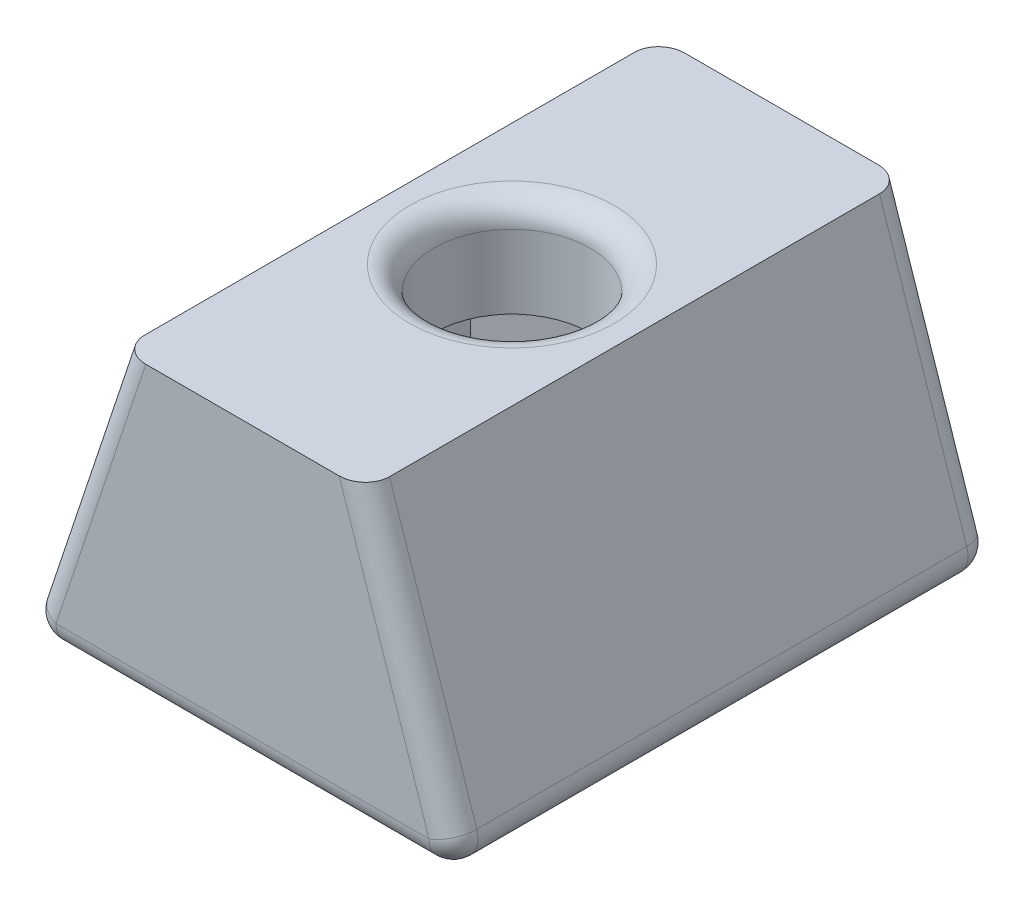
ISO-10303-21;
HEADER;
FILE_DESCRIPTION(('STEP AP214'),'2;1');
FILE_NAME('part.step','',(''),(''),'','','');
FILE_SCHEMA(('AUTOMOTIVE_DESIGN { 1 0 10303 214 1 1 1 1 }'));
ENDSEC;
DATA;
#1=APPLICATION_CONTEXT('core data for automotive mechanical design processes');
#2=APPLICATION_PROTOCOL_DEFINITION('international standard','automotive_design',2000,#1);
#3=PRODUCT_CONTEXT('',#1,'mechanical');
#4=PRODUCT('Part','Part','',(#3));
#5=PRODUCT_RELATED_PRODUCT_CATEGORY('part','',(#4));
#6=PRODUCT_DEFINITION_FORMATION('','',#4);
#7=PRODUCT_DEFINITION_CONTEXT('part definition',#1,'design');
#8=PRODUCT_DEFINITION('design','',#6,#7);
#9=PRODUCT_DEFINITION_SHAPE('','',#8);
#10=(LENGTH_UNIT() NAMED_UNIT(*) SI_UNIT(.MILLI.,.METRE.));
#11=(NAMED_UNIT(*) PLANE_ANGLE_UNIT() SI_UNIT($,.RADIAN.));
#12=(NAMED_UNIT(*) SI_UNIT($,.STERADIAN.) SOLID_ANGLE_UNIT());
#13=UNCERTAINTY_MEASURE_WITH_UNIT(LENGTH_MEASURE(1.E-05),#10,'distance_accuracy_value','');
#14=(GEOMETRIC_REPRESENTATION_CONTEXT(3) GLOBAL_UNCERTAINTY_ASSIGNED_CONTEXT((#13)) GLOBAL_UNIT_ASSIGNED_CONTEXT((#10,
#11,#12)) REPRESENTATION_CONTEXT('',''));
#15=CARTESIAN_POINT('',(0.,0.,0.));
#16=DIRECTION('',(0.,0.,1.));
#17=DIRECTION('',(1.,0.,0.));
#18=AXIS2_PLACEMENT_3D('',#15,#16,#17);
#19=CARTESIAN_POINT('',(3.99884838976547,12.,-22.));
#20=DIRECTION('',(-0.948710608132913,0.31614582397381,0.));
#21=DIRECTION('',(-0.31614582397381,-0.948710608132913,0.));
#22=AXIS2_PLACEMENT_3D('',#19,#20,#21);
#23=PLANE('',#22);
#24=DIRECTION('',(0.,0.,1.));
#25=VECTOR('',#24,1.);
#26=CARTESIAN_POINT('',(0.438588967407851,1.31614582397381,-22.));
#27=LINE('',#26,#25);
#28=CARTESIAN_POINT('',(0.438588967407851,1.31614582397381,-21.));
#29=VERTEX_POINT('',#28);
#30=CARTESIAN_POINT('',(0.438588967407851,1.31614582397381,-1.));
#31=VERTEX_POINT('',#30);
#32=EDGE_CURVE('E269',#29,#31,#27,.T.);
#33=ORIENTED_EDGE('',*,*,#32,.T.);
#34=DIRECTION('',(-0.31614582397381,-0.948710608132913,0.));
#35=VECTOR('',#34,1.);
#36=CARTESIAN_POINT('',(3.99884838976547,12.,-1.));
#37=LINE('',#36,#35);
#38=CARTESIAN_POINT('',(3.99884838976547,12.,-1.));
#39=VERTEX_POINT('',#38);
#40=EDGE_CURVE('E271',#31,#39,#37,.F.);
#41=ORIENTED_EDGE('',*,*,#40,.T.);
#42=DIRECTION('',(0.,0.,1.));
#43=VECTOR('',#42,1.);
#44=CARTESIAN_POINT('',(3.99884838976547,12.,-22.));
#45=LINE('',#44,#43);
#46=CARTESIAN_POINT('',(3.99884838976547,12.,-21.));
#47=VERTEX_POINT('',#46);
#48=EDGE_CURVE('E227',#47,#39,#45,.T.);
#49=ORIENTED_EDGE('',*,*,#48,.F.);
#50=DIRECTION('',(-0.31614582397381,-0.948710608132913,0.));
#51=VECTOR('',#50,1.);
#52=CARTESIAN_POINT('',(0.,0.,-21.));
#53=LINE('',#52,#51);
#54=EDGE_CURVE('E267',#47,#29,#53,.T.);
#55=ORIENTED_EDGE('',*,*,#54,.T.);
#56=EDGE_LOOP('',(#33,#41,#49,#55));
#57=FACE_BOUND('',#56,.T.);
#58=ADVANCED_FACE('F37',(#57),#23,.T.);
#59=CARTESIAN_POINT('',(14.0011516102345,12.,-22.));
#60=DIRECTION('',(0.,1.,0.));
#61=DIRECTION('',(-1.,0.,0.));
#62=AXIS2_PLACEMENT_3D('',#59,#60,#61);
#63=PLANE('',#62);
#64=CARTESIAN_POINT('',(8.99884838976547,12.,-11.));
#65=DIRECTION('',(0.,1.,0.));
#66=DIRECTION('',(-1.,0.,0.));
#67=AXIS2_PLACEMENT_3D('',#64,#65,#66);
#68=CIRCLE('',#67,4.175);
#69=CARTESIAN_POINT('',(4.82384838976547,12.,-11.));
#70=VERTEX_POINT('',#69);
#71=EDGE_CURVE('E11',#70,#70,#68,.F.);
#72=ORIENTED_EDGE('',*,*,#71,.T.);
#73=EDGE_LOOP('',(#72));
#74=FACE_BOUND('',#73,.T.);
#75=DIRECTION('',(0.,0.,1.));
#76=VECTOR('',#75,1.);
#77=CARTESIAN_POINT('',(14.0011516102345,12.,-22.));
#78=LINE('',#77,#76);
#79=CARTESIAN_POINT('',(14.0011516102345,12.,-21.));
#80=VERTEX_POINT('',#79);
#81=CARTESIAN_POINT('',(14.0011516102345,12.,-1.));
#82=VERTEX_POINT('',#81);
#83=EDGE_CURVE('E224',#80,#82,#78,.T.);
#84=ORIENTED_EDGE('',*,*,#83,.F.);
#85=CARTESIAN_POINT('',(12.9470894005076,12.,-21.));
#86=DIRECTION('',(0.,1.,0.));
#87=DIRECTION('',(1.,0.,0.));
#88=AXIS2_PLACEMENT_3D('',#85,#86,#87);
#89=ELLIPSE('',#88,1.05406220972697,1.);
#90=CARTESIAN_POINT('',(12.9470894005076,12.,-22.));
#91=VERTEX_POINT('',#90);
#92=EDGE_CURVE('E46',#80,#91,#89,.T.);
#93=ORIENTED_EDGE('',*,*,#92,.T.);
#94=DIRECTION('',(-1.,0.,0.));
#95=VECTOR('',#94,1.);
#96=CARTESIAN_POINT('',(14.0011516102345,12.,-22.));
#97=LINE('',#96,#95);
#98=CARTESIAN_POINT('',(5.05291059949245,12.,-22.));
#99=VERTEX_POINT('',#98);
#100=EDGE_CURVE('E221',#91,#99,#97,.T.);
#101=ORIENTED_EDGE('',*,*,#100,.T.);
#102=CARTESIAN_POINT('',(5.05291059949245,12.,-21.));
#103=DIRECTION('',(0.,1.,0.));
#104=DIRECTION('',(1.,0.,0.));
#105=AXIS2_PLACEMENT_3D('',#102,#103,#104);
#106=ELLIPSE('',#105,1.05406220972698,1.);
#107=EDGE_CURVE('E291',#99,#47,#106,.T.);
#108=ORIENTED_EDGE('',*,*,#107,.T.);
#109=ORIENTED_EDGE('',*,*,#48,.T.);
#110=CARTESIAN_POINT('',(5.05291059949245,12.,-1.));
#111=DIRECTION('',(0.,1.,0.));
#112=DIRECTION('',(-1.,0.,0.));
#113=AXIS2_PLACEMENT_3D('',#110,#111,#112);
#114=ELLIPSE('',#113,1.05406220972698,1.);
#115=CARTESIAN_POINT('',(5.05291059949245,12.,0.));
#116=VERTEX_POINT('',#115);
#117=EDGE_CURVE('E293',#39,#116,#114,.T.);
#118=ORIENTED_EDGE('',*,*,#117,.T.);
#119=DIRECTION('',(-1.,0.,0.));
#120=VECTOR('',#119,1.);
#121=CARTESIAN_POINT('',(14.0011516102345,12.,0.));
#122=LINE('',#121,#120);
#123=CARTESIAN_POINT('',(12.9470894005076,12.,0.));
#124=VERTEX_POINT('',#123);
#125=EDGE_CURVE('E212',#124,#116,#122,.T.);
#126=ORIENTED_EDGE('',*,*,#125,.F.);
#127=CARTESIAN_POINT('',(12.9470894005076,12.,-1.));
#128=DIRECTION('',(0.,1.,0.));
#129=DIRECTION('',(-1.,0.,0.));
#130=AXIS2_PLACEMENT_3D('',#127,#128,#129);
#131=ELLIPSE('',#130,1.05406220972697,1.);
#132=EDGE_CURVE('E295',#124,#82,#131,.T.);
#133=ORIENTED_EDGE('',*,*,#132,.T.);
#134=EDGE_LOOP('',(#84,#93,#101,#108,#109,#118,#126,#133));
#135=FACE_BOUND('',#134,.T.);
#136=ADVANCED_FACE('F386',(#74,#135),#63,.T.);
#137=CARTESIAN_POINT('',(18.,0.,-22.));
#138=DIRECTION('',(0.948710608132913,0.31614582397381,0.));
#139=DIRECTION('',(-0.31614582397381,0.948710608132913,0.));
#140=AXIS2_PLACEMENT_3D('',#137,#138,#139);
#141=PLANE('',#140);
#142=DIRECTION('',(0.,0.,1.));
#143=VECTOR('',#142,1.);
#144=CARTESIAN_POINT('',(17.5614110325921,1.31614582397381,-22.));
#145=LINE('',#144,#143);
#146=CARTESIAN_POINT('',(17.5614110325921,1.31614582397381,-1.));
#147=VERTEX_POINT('',#146);
#148=CARTESIAN_POINT('',(17.5614110325921,1.31614582397381,-21.));
#149=VERTEX_POINT('',#148);
#150=EDGE_CURVE('E256',#147,#149,#145,.F.);
#151=ORIENTED_EDGE('',*,*,#150,.T.);
#152=DIRECTION('',(-0.31614582397381,0.948710608132913,0.));
#153=VECTOR('',#152,1.);
#154=CARTESIAN_POINT('',(14.0011516102345,12.,-21.));
#155=LINE('',#154,#153);
#156=EDGE_CURVE('E259',#149,#80,#155,.T.);
#157=ORIENTED_EDGE('',*,*,#156,.T.);
#158=ORIENTED_EDGE('',*,*,#83,.T.);
#159=DIRECTION('',(-0.31614582397381,0.948710608132913,0.));
#160=VECTOR('',#159,1.);
#161=CARTESIAN_POINT('',(18.,0.,-1.));
#162=LINE('',#161,#160);
#163=EDGE_CURVE('E254',#82,#147,#162,.F.);
#164=ORIENTED_EDGE('',*,*,#163,.T.);
#165=EDGE_LOOP('',(#151,#157,#158,#164));
#166=FACE_BOUND('',#165,.T.);
#167=ADVANCED_FACE('F392',(#166),#141,.T.);
#168=CARTESIAN_POINT('',(0.,0.,-22.));
#169=DIRECTION('',(0.,-1.,0.));
#170=DIRECTION('',(0.,0.,-1.));
#171=AXIS2_PLACEMENT_3D('',#168,#169,#170);
#172=PLANE('',#171);
#173=DIRECTION('',(1.,0.,0.));
#174=VECTOR('',#173,1.);
#175=CARTESIAN_POINT('',(18.,0.,-21.));
#176=LINE('',#175,#174);
#177=CARTESIAN_POINT('',(1.38729957554076,0.,-21.));
#178=VERTEX_POINT('',#177);
#179=CARTESIAN_POINT('',(16.6127004244592,0.,-21.));
#180=VERTEX_POINT('',#179);
#181=EDGE_CURVE('E249',#178,#180,#176,.T.);
#182=ORIENTED_EDGE('',*,*,#181,.T.);
#183=DIRECTION('',(0.,0.,1.));
#184=VECTOR('',#183,1.);
#185=CARTESIAN_POINT('',(16.6127004244592,0.,-22.));
#186=LINE('',#185,#184);
#187=CARTESIAN_POINT('',(16.6127004244592,0.,-1.));
#188=VERTEX_POINT('',#187);
#189=EDGE_CURVE('E251',#180,#188,#186,.T.);
#190=ORIENTED_EDGE('',*,*,#189,.T.);
#191=DIRECTION('',(1.,0.,0.));
#192=VECTOR('',#191,1.);
#193=CARTESIAN_POINT('',(0.,0.,-1.));
#194=LINE('',#193,#192);
#195=CARTESIAN_POINT('',(1.38729957554076,0.,-1.));
#196=VERTEX_POINT('',#195);
#197=EDGE_CURVE('E245',#188,#196,#194,.F.);
#198=ORIENTED_EDGE('',*,*,#197,.T.);
#199=DIRECTION('',(0.,0.,1.));
#200=VECTOR('',#199,1.);
#201=CARTESIAN_POINT('',(1.38729957554076,0.,-22.));
#202=LINE('',#201,#200);
#203=EDGE_CURVE('E247',#196,#178,#202,.F.);
#204=ORIENTED_EDGE('',*,*,#203,.T.);
#205=EDGE_LOOP('',(#182,#190,#198,#204));
#206=FACE_BOUND('',#205,.T.);
#207=DIRECTION('',(-0.866025403784439,0.,0.5));
#208=VECTOR('',#207,1.);
#209=CARTESIAN_POINT('',(13.5,0.,-7.82457351945706));
#210=LINE('',#209,#208);
#211=CARTESIAN_POINT('',(9.,0.,-5.22649730810374));
#212=VERTEX_POINT('',#211);
#213=CARTESIAN_POINT('',(14.,0.,-8.11324865405187));
#214=VERTEX_POINT('',#213);
#215=EDGE_CURVE('E240',#212,#214,#210,.F.);
#216=ORIENTED_EDGE('',*,*,#215,.T.);
#217=DIRECTION('',(0.,0.,1.));
#218=VECTOR('',#217,1.);
#219=CARTESIAN_POINT('',(14.,0.,-13.3094010767585));
#220=LINE('',#219,#218);
#221=CARTESIAN_POINT('',(14.,0.,-13.8867513459481));
#222=VERTEX_POINT('',#221);
#223=EDGE_CURVE('E242',#214,#222,#220,.F.);
#224=ORIENTED_EDGE('',*,*,#223,.T.);
#225=DIRECTION('',(0.866025403784439,0.,0.5));
#226=VECTOR('',#225,1.);
#227=CARTESIAN_POINT('',(9.5,0.,-16.4848275573014));
#228=LINE('',#227,#226);
#229=CARTESIAN_POINT('',(9.,0.,-16.7735026918963));
#230=VERTEX_POINT('',#229);
#231=EDGE_CURVE('E230',#222,#230,#228,.F.);
#232=ORIENTED_EDGE('',*,*,#231,.T.);
#233=DIRECTION('',(0.866025403784438,0.,-0.5));
#234=VECTOR('',#233,1.);
#235=CARTESIAN_POINT('',(4.5,0.,-14.1754264805429));
#236=LINE('',#235,#234);
#237=CARTESIAN_POINT('',(4.,0.,-13.8867513459481));
#238=VERTEX_POINT('',#237);
#239=EDGE_CURVE('E234',#230,#238,#236,.F.);
#240=ORIENTED_EDGE('',*,*,#239,.T.);
#241=DIRECTION('',(0.,0.,-1.));
#242=VECTOR('',#241,1.);
#243=CARTESIAN_POINT('',(4.,0.,-8.6905989232415));
#244=LINE('',#243,#242);
#245=CARTESIAN_POINT('',(4.,0.,-8.11324865405187));
#246=VERTEX_POINT('',#245);
#247=EDGE_CURVE('E236',#238,#246,#244,.F.);
#248=ORIENTED_EDGE('',*,*,#247,.T.);
#249=DIRECTION('',(-0.866025403784439,0.,-0.5));
#250=VECTOR('',#249,1.);
#251=CARTESIAN_POINT('',(8.49999999999999,0.,-5.51517244269856));
#252=LINE('',#251,#250);
#253=EDGE_CURVE('E238',#246,#212,#252,.F.);
#254=ORIENTED_EDGE('',*,*,#253,.T.);
#255=EDGE_LOOP('',(#216,#224,#232,#240,#248,#254));
#256=FACE_BOUND('',#255,.T.);
#257=ADVANCED_FACE('F356',(#206,#256),#172,.T.);
#258=CARTESIAN_POINT('',(0.,0.,-22.));
#259=DIRECTION('',(0.,0.,1.));
#260=DIRECTION('',(1.,0.,0.));
#261=AXIS2_PLACEMENT_3D('',#258,#259,#260);
#262=PLANE('',#261);
#263=ORIENTED_EDGE('',*,*,#100,.F.);
#264=DIRECTION('',(-0.31614582397381,0.948710608132913,0.));
#265=VECTOR('',#264,1.);
#266=CARTESIAN_POINT('',(17.0512893918671,-0.31614582397381,-22.));
#267=LINE('',#266,#265);
#268=CARTESIAN_POINT('',(16.6127004244592,1.,-22.));
#269=VERTEX_POINT('',#268);
#270=EDGE_CURVE('E265',#91,#269,#267,.F.);
#271=ORIENTED_EDGE('',*,*,#270,.T.);
#272=DIRECTION('',(1.,0.,0.));
#273=VECTOR('',#272,1.);
#274=CARTESIAN_POINT('',(0.,1.,-22.));
#275=LINE('',#274,#273);
#276=CARTESIAN_POINT('',(1.38729957554076,1.,-22.));
#277=VERTEX_POINT('',#276);
#278=EDGE_CURVE('E263',#269,#277,#275,.F.);
#279=ORIENTED_EDGE('',*,*,#278,.T.);
#280=DIRECTION('',(-0.31614582397381,-0.948710608132913,0.));
#281=VECTOR('',#280,1.);
#282=CARTESIAN_POINT('',(4.94755899789838,11.6838541760262,-22.));
#283=LINE('',#282,#281);
#284=EDGE_CURVE('E261',#277,#99,#283,.F.);
#285=ORIENTED_EDGE('',*,*,#284,.T.);
#286=EDGE_LOOP('',(#263,#271,#279,#285));
#287=FACE_BOUND('',#286,.T.);
#288=ADVANCED_FACE('F676',(#287),#262,.F.);
#289=CARTESIAN_POINT('',(0.,0.,0.));
#290=DIRECTION('',(0.,0.,1.));
#291=DIRECTION('',(1.,0.,0.));
#292=AXIS2_PLACEMENT_3D('',#289,#290,#291);
#293=PLANE('',#292);
#294=DIRECTION('',(1.,0.,0.));
#295=VECTOR('',#294,1.);
#296=CARTESIAN_POINT('',(0.,1.,0.));
#297=LINE('',#296,#295);
#298=CARTESIAN_POINT('',(1.38729957554076,1.,0.));
#299=VERTEX_POINT('',#298);
#300=CARTESIAN_POINT('',(16.6127004244592,1.,0.));
#301=VERTEX_POINT('',#300);
#302=EDGE_CURVE('E275',#299,#301,#297,.T.);
#303=ORIENTED_EDGE('',*,*,#302,.T.);
#304=DIRECTION('',(-0.31614582397381,0.948710608132913,0.));
#305=VECTOR('',#304,1.);
#306=CARTESIAN_POINT('',(15.2522221155777,5.08261032060192,0.));
#307=LINE('',#306,#305);
#308=EDGE_CURVE('E277',#301,#124,#307,.T.);
#309=ORIENTED_EDGE('',*,*,#308,.T.);
#310=ORIENTED_EDGE('',*,*,#125,.T.);
#311=DIRECTION('',(-0.31614582397381,-0.948710608132913,0.));
#312=VECTOR('',#311,1.);
#313=CARTESIAN_POINT('',(0.948710608132912,-0.31614582397381,0.));
#314=LINE('',#313,#312);
#315=EDGE_CURVE('E273',#116,#299,#314,.T.);
#316=ORIENTED_EDGE('',*,*,#315,.T.);
#317=EDGE_LOOP('',(#303,#309,#310,#316));
#318=FACE_BOUND('',#317,.T.);
#319=ADVANCED_FACE('F382',(#318),#293,.T.);
#320=CARTESIAN_POINT('',(9.,8.,-15.618802153517));
#321=DIRECTION('',(0.5,0.,-0.866025403784439));
#322=DIRECTION('',(-0.866025403784439,0.,-0.5));
#323=AXIS2_PLACEMENT_3D('',#320,#321,#322);
#324=PLANE('',#323);
#325=DIRECTION('',(0.,-1.,0.));
#326=VECTOR('',#325,1.);
#327=CARTESIAN_POINT('',(9.,8.,-15.618802153517));
#328=LINE('',#327,#326);
#329=CARTESIAN_POINT('',(9.,8.,-15.618802153517));
#330=VERTEX_POINT('',#329);
#331=CARTESIAN_POINT('',(9.,1.,-15.618802153517));
#332=VERTEX_POINT('',#331);
#333=EDGE_CURVE('E210',#330,#332,#328,.T.);
#334=ORIENTED_EDGE('',*,*,#333,.T.);
#335=DIRECTION('',(0.866025403784439,0.,0.5));
#336=VECTOR('',#335,1.);
#337=CARTESIAN_POINT('',(13.,1.,-13.3094010767585));
#338=LINE('',#337,#336);
#339=CARTESIAN_POINT('',(13.,1.,-13.3094010767585));
#340=VERTEX_POINT('',#339);
#341=EDGE_CURVE('E178',#332,#340,#338,.T.);
#342=ORIENTED_EDGE('',*,*,#341,.T.);
#343=DIRECTION('',(0.,-1.,0.));
#344=VECTOR('',#343,1.);
#345=CARTESIAN_POINT('',(13.,8.,-13.3094010767585));
#346=LINE('',#345,#344);
#347=CARTESIAN_POINT('',(13.,8.,-13.3094010767585));
#348=VERTEX_POINT('',#347);
#349=EDGE_CURVE('E171',#348,#340,#346,.T.);
#350=ORIENTED_EDGE('',*,*,#349,.F.);
#351=DIRECTION('',(0.866025403784439,0.,0.5));
#352=VECTOR('',#351,1.);
#353=CARTESIAN_POINT('',(9.,8.,-15.618802153517));
#354=LINE('',#353,#352);
#355=EDGE_CURVE('E175',#330,#348,#354,.T.);
#356=ORIENTED_EDGE('',*,*,#355,.F.);
#357=EDGE_LOOP('',(#334,#342,#350,#356));
#358=FACE_BOUND('',#357,.T.);
#359=ADVANCED_FACE('F173',(#358),#324,.F.);
#360=CARTESIAN_POINT('',(5.,8.,-13.3094010767585));
#361=DIRECTION('',(-0.5,0.,-0.866025403784439));
#362=DIRECTION('',(-0.866025403784438,0.,0.5));
#363=AXIS2_PLACEMENT_3D('',#360,#361,#362);
#364=PLANE('',#363);
#365=DIRECTION('',(0.,-1.,0.));
#366=VECTOR('',#365,1.);
#367=CARTESIAN_POINT('',(5.,8.,-13.3094010767585));
#368=LINE('',#367,#366);
#369=CARTESIAN_POINT('',(5.,8.,-13.3094010767585));
#370=VERTEX_POINT('',#369);
#371=CARTESIAN_POINT('',(5.,1.,-13.3094010767585));
#372=VERTEX_POINT('',#371);
#373=EDGE_CURVE('E213',#370,#372,#368,.T.);
#374=ORIENTED_EDGE('',*,*,#373,.T.);
#375=DIRECTION('',(0.866025403784438,0.,-0.5));
#376=VECTOR('',#375,1.);
#377=CARTESIAN_POINT('',(9.,1.,-15.618802153517));
#378=LINE('',#377,#376);
#379=EDGE_CURVE('E54',#372,#332,#378,.T.);
#380=ORIENTED_EDGE('',*,*,#379,.T.);
#381=ORIENTED_EDGE('',*,*,#333,.F.);
#382=DIRECTION('',(0.866025403784438,0.,-0.5));
#383=VECTOR('',#382,1.);
#384=CARTESIAN_POINT('',(5.,8.,-13.3094010767585));
#385=LINE('',#384,#383);
#386=EDGE_CURVE('E183',#370,#330,#385,.T.);
#387=ORIENTED_EDGE('',*,*,#386,.F.);
#388=EDGE_LOOP('',(#374,#380,#381,#387));
#389=FACE_BOUND('',#388,.T.);
#390=ADVANCED_FACE('F374',(#389),#364,.F.);
#391=CARTESIAN_POINT('',(5.,8.,-8.6905989232415));
#392=DIRECTION('',(-1.,0.,0.));
#393=DIRECTION('',(0.,0.,1.));
#394=AXIS2_PLACEMENT_3D('',#391,#392,#393);
#395=PLANE('',#394);
#396=DIRECTION('',(0.,-1.,0.));
#397=VECTOR('',#396,1.);
#398=CARTESIAN_POINT('',(5.,8.,-8.6905989232415));
#399=LINE('',#398,#397);
#400=CARTESIAN_POINT('',(5.,8.,-8.6905989232415));
#401=VERTEX_POINT('',#400);
#402=CARTESIAN_POINT('',(5.,1.,-8.6905989232415));
#403=VERTEX_POINT('',#402);
#404=EDGE_CURVE('E215',#401,#403,#399,.T.);
#405=ORIENTED_EDGE('',*,*,#404,.T.);
#406=DIRECTION('',(0.,0.,-1.));
#407=VECTOR('',#406,1.);
#408=CARTESIAN_POINT('',(5.,1.,-13.3094010767585));
#409=LINE('',#408,#407);
#410=EDGE_CURVE('E62',#403,#372,#409,.T.);
#411=ORIENTED_EDGE('',*,*,#410,.T.);
#412=ORIENTED_EDGE('',*,*,#373,.F.);
#413=DIRECTION('',(0.,0.,-1.));
#414=VECTOR('',#413,1.);
#415=CARTESIAN_POINT('',(5.,8.,-8.6905989232415));
#416=LINE('',#415,#414);
#417=EDGE_CURVE('E207',#401,#370,#416,.T.);
#418=ORIENTED_EDGE('',*,*,#417,.F.);
#419=EDGE_LOOP('',(#405,#411,#412,#418));
#420=FACE_BOUND('',#419,.T.);
#421=ADVANCED_FACE('F373',(#420),#395,.F.);
#422=CARTESIAN_POINT('',(9.,8.,-6.38119784648299));
#423=DIRECTION('',(-0.5,0.,0.866025403784439));
#424=DIRECTION('',(0.866025403784439,0.,0.5));
#425=AXIS2_PLACEMENT_3D('',#422,#423,#424);
#426=PLANE('',#425);
#427=DIRECTION('',(0.,-1.,0.));
#428=VECTOR('',#427,1.);
#429=CARTESIAN_POINT('',(9.,8.,-6.38119784648299));
#430=LINE('',#429,#428);
#431=CARTESIAN_POINT('',(9.,8.,-6.38119784648299));
#432=VERTEX_POINT('',#431);
#433=CARTESIAN_POINT('',(9.,1.,-6.38119784648299));
#434=VERTEX_POINT('',#433);
#435=EDGE_CURVE('E217',#432,#434,#430,.T.);
#436=ORIENTED_EDGE('',*,*,#435,.T.);
#437=DIRECTION('',(-0.866025403784439,0.,-0.5));
#438=VECTOR('',#437,1.);
#439=CARTESIAN_POINT('',(5.,1.,-8.6905989232415));
#440=LINE('',#439,#438);
#441=EDGE_CURVE('E283',#434,#403,#440,.T.);
#442=ORIENTED_EDGE('',*,*,#441,.T.);
#443=ORIENTED_EDGE('',*,*,#404,.F.);
#444=DIRECTION('',(-0.866025403784439,0.,-0.5));
#445=VECTOR('',#444,1.);
#446=CARTESIAN_POINT('',(9.,8.,-6.38119784648299));
#447=LINE('',#446,#445);
#448=EDGE_CURVE('E204',#432,#401,#447,.T.);
#449=ORIENTED_EDGE('',*,*,#448,.F.);
#450=EDGE_LOOP('',(#436,#442,#443,#449));
#451=FACE_BOUND('',#450,.T.);
#452=ADVANCED_FACE('F372',(#451),#426,.F.);
#453=CARTESIAN_POINT('',(13.,8.,-8.6905989232415));
#454=DIRECTION('',(0.5,0.,0.866025403784439));
#455=DIRECTION('',(0.866025403784439,0.,-0.5));
#456=AXIS2_PLACEMENT_3D('',#453,#454,#455);
#457=PLANE('',#456);
#458=DIRECTION('',(0.,-1.,0.));
#459=VECTOR('',#458,1.);
#460=CARTESIAN_POINT('',(13.,8.,-8.6905989232415));
#461=LINE('',#460,#459);
#462=CARTESIAN_POINT('',(13.,8.,-8.6905989232415));
#463=VERTEX_POINT('',#462);
#464=CARTESIAN_POINT('',(13.,1.,-8.6905989232415));
#465=VERTEX_POINT('',#464);
#466=EDGE_CURVE('E182',#463,#465,#461,.T.);
#467=ORIENTED_EDGE('',*,*,#466,.T.);
#468=DIRECTION('',(-0.866025403784439,0.,0.5));
#469=VECTOR('',#468,1.);
#470=CARTESIAN_POINT('',(8.99999999999999,1.,-6.38119784648299));
#471=LINE('',#470,#469);
#472=EDGE_CURVE('E281',#465,#434,#471,.T.);
#473=ORIENTED_EDGE('',*,*,#472,.T.);
#474=ORIENTED_EDGE('',*,*,#435,.F.);
#475=DIRECTION('',(-0.866025403784439,0.,0.5));
#476=VECTOR('',#475,1.);
#477=CARTESIAN_POINT('',(13.,8.,-8.6905989232415));
#478=LINE('',#477,#476);
#479=EDGE_CURVE('E192',#463,#432,#478,.T.);
#480=ORIENTED_EDGE('',*,*,#479,.F.);
#481=EDGE_LOOP('',(#467,#473,#474,#480));
#482=FACE_BOUND('',#481,.T.);
#483=ADVANCED_FACE('F368',(#482),#457,.F.);
#484=CARTESIAN_POINT('',(13.,8.,-13.3094010767585));
#485=DIRECTION('',(1.,0.,0.));
#486=DIRECTION('',(0.,0.,-1.));
#487=AXIS2_PLACEMENT_3D('',#484,#485,#486);
#488=PLANE('',#487);
#489=ORIENTED_EDGE('',*,*,#349,.T.);
#490=DIRECTION('',(0.,0.,1.));
#491=VECTOR('',#490,1.);
#492=CARTESIAN_POINT('',(13.,1.,-8.6905989232415));
#493=LINE('',#492,#491);
#494=EDGE_CURVE('E279',#340,#465,#493,.T.);
#495=ORIENTED_EDGE('',*,*,#494,.T.);
#496=ORIENTED_EDGE('',*,*,#466,.F.);
#497=DIRECTION('',(0.,0.,1.));
#498=VECTOR('',#497,1.);
#499=CARTESIAN_POINT('',(13.,8.,-13.3094010767585));
#500=LINE('',#499,#498);
#501=EDGE_CURVE('E186',#348,#463,#500,.T.);
#502=ORIENTED_EDGE('',*,*,#501,.F.);
#503=EDGE_LOOP('',(#489,#495,#496,#502));
#504=FACE_BOUND('',#503,.T.);
#505=ADVANCED_FACE('F187',(#504),#488,.F.);
#506=CARTESIAN_POINT('',(0.,8.,0.));
#507=DIRECTION('',(0.,-1.,0.));
#508=DIRECTION('',(0.,0.,-1.));
#509=AXIS2_PLACEMENT_3D('',#506,#507,#508);
#510=PLANE('',#509);
#511=CARTESIAN_POINT('',(8.99884838976547,8.,-11.));
#512=DIRECTION('',(0.,-1.,0.));
#513=DIRECTION('',(0.,0.,-1.));
#514=AXIS2_PLACEMENT_3D('',#511,#512,#513);
#515=CIRCLE('',#514,3.175);
#516=CARTESIAN_POINT('',(8.99884838976547,8.,-14.175));
#517=VERTEX_POINT('',#516);
#518=EDGE_CURVE('E197',#517,#517,#515,.T.);
#519=ORIENTED_EDGE('',*,*,#518,.F.);
#520=EDGE_LOOP('',(#519));
#521=FACE_BOUND('',#520,.T.);
#522=ORIENTED_EDGE('',*,*,#355,.T.);
#523=ORIENTED_EDGE('',*,*,#501,.T.);
#524=ORIENTED_EDGE('',*,*,#479,.T.);
#525=ORIENTED_EDGE('',*,*,#448,.T.);
#526=ORIENTED_EDGE('',*,*,#417,.T.);
#527=ORIENTED_EDGE('',*,*,#386,.T.);
#528=EDGE_LOOP('',(#522,#523,#524,#525,#526,#527));
#529=FACE_BOUND('',#528,.T.);
#530=ADVANCED_FACE('F194',(#521,#529),#510,.T.);
#531=CARTESIAN_POINT('',(8.99884838976547,12.,-11.));
#532=DIRECTION('',(0.,1.,0.));
#533=DIRECTION('',(0.,0.,1.));
#534=AXIS2_PLACEMENT_3D('',#531,#532,#533);
#535=CYLINDRICAL_SURFACE('',#534,3.175);
#536=CARTESIAN_POINT('',(8.99884838976547,11.,-11.));
#537=DIRECTION('',(0.,1.,0.));
#538=DIRECTION('',(-1.,0.,0.));
#539=AXIS2_PLACEMENT_3D('',#536,#537,#538);
#540=CIRCLE('',#539,3.175);
#541=CARTESIAN_POINT('',(5.82384838976547,11.,-11.));
#542=VERTEX_POINT('',#541);
#543=EDGE_CURVE('E288',#542,#542,#540,.T.);
#544=ORIENTED_EDGE('',*,*,#543,.T.);
#545=EDGE_LOOP('',(#544));
#546=FACE_BOUND('',#545,.T.);
#547=ORIENTED_EDGE('',*,*,#518,.T.);
#548=EDGE_LOOP('',(#547));
#549=FACE_BOUND('',#548,.T.);
#550=ADVANCED_FACE('F445',(#546,#549),#535,.F.);
#551=CARTESIAN_POINT('',(4.94755899789838,11.6838541760262,-21.));
#552=DIRECTION('',(0.31614582397381,0.948710608132913,0.));
#553=DIRECTION('',(-0.948710608132913,0.31614582397381,0.));
#554=AXIS2_PLACEMENT_3D('',#551,#552,#553);
#555=CYLINDRICAL_SURFACE('',#554,1.);
#556=ORIENTED_EDGE('',*,*,#107,.F.);
#557=ORIENTED_EDGE('',*,*,#284,.F.);
#558=CARTESIAN_POINT('',(1.38729957554076,0.999999999999999,-21.));
#559=DIRECTION('',(-0.31614582397381,-0.948710608132913,0.));
#560=DIRECTION('',(0.948710608132913,-0.31614582397381,0.));
#561=AXIS2_PLACEMENT_3D('',#558,#559,#560);
#562=CIRCLE('',#561,1.);
#563=EDGE_CURVE('E200',#29,#277,#562,.T.);
#564=ORIENTED_EDGE('',*,*,#563,.F.);
#565=ORIENTED_EDGE('',*,*,#54,.F.);
#566=EDGE_LOOP('',(#556,#557,#564,#565));
#567=FACE_BOUND('',#566,.T.);
#568=ADVANCED_FACE('F441',(#567),#555,.T.);
#569=CARTESIAN_POINT('',(1.38729957554076,0.999999999999999,-22.));
#570=DIRECTION('',(0.,0.,1.));
#571=DIRECTION('',(1.,0.,0.));
#572=AXIS2_PLACEMENT_3D('',#569,#570,#571);
#573=CYLINDRICAL_SURFACE('',#572,1.);
#574=CARTESIAN_POINT('',(1.38729957554076,0.999999999999999,-1.));
#575=DIRECTION('',(0.,0.,1.));
#576=DIRECTION('',(1.,0.,0.));
#577=AXIS2_PLACEMENT_3D('',#574,#575,#576);
#578=CIRCLE('',#577,1.);
#579=EDGE_CURVE('E323',#31,#196,#578,.T.);
#580=ORIENTED_EDGE('',*,*,#579,.F.);
#581=ORIENTED_EDGE('',*,*,#32,.F.);
#582=CARTESIAN_POINT('',(1.38729957554076,1.,-21.));
#583=DIRECTION('',(0.,0.,-1.));
#584=DIRECTION('',(-1.,0.,0.));
#585=AXIS2_PLACEMENT_3D('',#582,#583,#584);
#586=CIRCLE('',#585,1.);
#587=EDGE_CURVE('E326',#178,#29,#586,.T.);
#588=ORIENTED_EDGE('',*,*,#587,.F.);
#589=ORIENTED_EDGE('',*,*,#203,.F.);
#590=EDGE_LOOP('',(#580,#581,#588,#589));
#591=FACE_BOUND('',#590,.T.);
#592=ADVANCED_FACE('F437',(#591),#573,.T.);
#593=CARTESIAN_POINT('',(0.948710608132912,-0.31614582397381,-1.));
#594=DIRECTION('',(-0.31614582397381,-0.948710608132913,0.));
#595=DIRECTION('',(0.948710608132913,-0.31614582397381,0.));
#596=AXIS2_PLACEMENT_3D('',#593,#594,#595);
#597=CYLINDRICAL_SURFACE('',#596,1.);
#598=ORIENTED_EDGE('',*,*,#117,.F.);
#599=ORIENTED_EDGE('',*,*,#40,.F.);
#600=CARTESIAN_POINT('',(1.38729957554076,1.,-1.));
#601=DIRECTION('',(-0.316145823973809,-0.948710608132913,0.));
#602=DIRECTION('',(0.948710608132913,-0.316145823973809,0.));
#603=AXIS2_PLACEMENT_3D('',#600,#601,#602);
#604=CIRCLE('',#603,1.);
#605=EDGE_CURVE('E320',#299,#31,#604,.T.);
#606=ORIENTED_EDGE('',*,*,#605,.F.);
#607=ORIENTED_EDGE('',*,*,#315,.F.);
#608=EDGE_LOOP('',(#598,#599,#606,#607));
#609=FACE_BOUND('',#608,.T.);
#610=ADVANCED_FACE('F433',(#609),#597,.T.);
#611=CARTESIAN_POINT('',(1.38729957554076,1.,-21.));
#612=DIRECTION('',(0.,0.,-1.));
#613=DIRECTION('',(-1.,0.,0.));
#614=AXIS2_PLACEMENT_3D('',#611,#612,#613);
#615=SPHERICAL_SURFACE('',#614,1.);
#616=ORIENTED_EDGE('',*,*,#587,.T.);
#617=ORIENTED_EDGE('',*,*,#563,.T.);
#618=CARTESIAN_POINT('',(1.38729957554076,1.,-21.));
#619=DIRECTION('',(-1.,0.,0.));
#620=DIRECTION('',(0.,0.,1.));
#621=AXIS2_PLACEMENT_3D('',#618,#619,#620);
#622=CIRCLE('',#621,1.);
#623=EDGE_CURVE('E317',#178,#277,#622,.F.);
#624=ORIENTED_EDGE('',*,*,#623,.F.);
#625=EDGE_LOOP('',(#616,#617,#624));
#626=FACE_BOUND('',#625,.T.);
#627=ADVANCED_FACE('F429',(#626),#615,.T.);
#628=CARTESIAN_POINT('',(1.38729957554076,1.,-1.));
#629=DIRECTION('',(0.,0.,1.));
#630=DIRECTION('',(1.,0.,0.));
#631=AXIS2_PLACEMENT_3D('',#628,#629,#630);
#632=SPHERICAL_SURFACE('',#631,1.);
#633=ORIENTED_EDGE('',*,*,#605,.T.);
#634=ORIENTED_EDGE('',*,*,#579,.T.);
#635=CARTESIAN_POINT('',(1.38729957554076,1.,-1.));
#636=DIRECTION('',(-1.,0.,0.));
#637=DIRECTION('',(0.,0.,1.));
#638=AXIS2_PLACEMENT_3D('',#635,#636,#637);
#639=CIRCLE('',#638,1.);
#640=EDGE_CURVE('E314',#299,#196,#639,.F.);
#641=ORIENTED_EDGE('',*,*,#640,.F.);
#642=EDGE_LOOP('',(#633,#634,#641));
#643=FACE_BOUND('',#642,.T.);
#644=ADVANCED_FACE('F425',(#643),#632,.T.);
#645=CARTESIAN_POINT('',(17.0512893918671,-0.31614582397381,-21.));
#646=DIRECTION('',(0.31614582397381,-0.948710608132913,0.));
#647=DIRECTION('',(0.948710608132913,0.31614582397381,0.));
#648=AXIS2_PLACEMENT_3D('',#645,#646,#647);
#649=CYLINDRICAL_SURFACE('',#648,1.);
#650=ORIENTED_EDGE('',*,*,#92,.F.);
#651=ORIENTED_EDGE('',*,*,#156,.F.);
#652=CARTESIAN_POINT('',(16.6127004244592,1.,-21.));
#653=DIRECTION('',(0.31614582397381,-0.948710608132913,0.));
#654=DIRECTION('',(0.948710608132913,0.31614582397381,0.));
#655=AXIS2_PLACEMENT_3D('',#652,#653,#654);
#656=CIRCLE('',#655,1.);
#657=EDGE_CURVE('E311',#269,#149,#656,.T.);
#658=ORIENTED_EDGE('',*,*,#657,.F.);
#659=ORIENTED_EDGE('',*,*,#270,.F.);
#660=EDGE_LOOP('',(#650,#651,#658,#659));
#661=FACE_BOUND('',#660,.T.);
#662=ADVANCED_FACE('F421',(#661),#649,.T.);
#663=CARTESIAN_POINT('',(0.,1.,-21.));
#664=DIRECTION('',(-1.,0.,0.));
#665=DIRECTION('',(0.,0.,1.));
#666=AXIS2_PLACEMENT_3D('',#663,#664,#665);
#667=CYLINDRICAL_SURFACE('',#666,1.);
#668=ORIENTED_EDGE('',*,*,#623,.T.);
#669=ORIENTED_EDGE('',*,*,#278,.F.);
#670=CARTESIAN_POINT('',(16.6127004244592,1.,-21.));
#671=DIRECTION('',(1.,0.,0.));
#672=DIRECTION('',(0.,0.,-1.));
#673=AXIS2_PLACEMENT_3D('',#670,#671,#672);
#674=CIRCLE('',#673,1.);
#675=EDGE_CURVE('E308',#180,#269,#674,.T.);
#676=ORIENTED_EDGE('',*,*,#675,.F.);
#677=ORIENTED_EDGE('',*,*,#181,.F.);
#678=EDGE_LOOP('',(#668,#669,#676,#677));
#679=FACE_BOUND('',#678,.T.);
#680=ADVANCED_FACE('F417',(#679),#667,.T.);
#681=CARTESIAN_POINT('',(0.,1.,-1.));
#682=DIRECTION('',(1.,0.,0.));
#683=DIRECTION('',(0.,0.,-1.));
#684=AXIS2_PLACEMENT_3D('',#681,#682,#683);
#685=CYLINDRICAL_SURFACE('',#684,1.);
#686=ORIENTED_EDGE('',*,*,#640,.T.);
#687=ORIENTED_EDGE('',*,*,#197,.F.);
#688=CARTESIAN_POINT('',(16.6127004244592,1.,-1.));
#689=DIRECTION('',(1.,0.,0.));
#690=DIRECTION('',(0.,0.,-1.));
#691=AXIS2_PLACEMENT_3D('',#688,#689,#690);
#692=CIRCLE('',#691,1.);
#693=EDGE_CURVE('E305',#301,#188,#692,.T.);
#694=ORIENTED_EDGE('',*,*,#693,.F.);
#695=ORIENTED_EDGE('',*,*,#302,.F.);
#696=EDGE_LOOP('',(#686,#687,#694,#695));
#697=FACE_BOUND('',#696,.T.);
#698=ADVANCED_FACE('F413',(#697),#685,.T.);
#699=CARTESIAN_POINT('',(15.2522221155777,5.08261032060192,-1.));
#700=DIRECTION('',(-0.31614582397381,0.948710608132913,0.));
#701=DIRECTION('',(-0.948710608132913,-0.31614582397381,0.));
#702=AXIS2_PLACEMENT_3D('',#699,#700,#701);
#703=CYLINDRICAL_SURFACE('',#702,1.);
#704=ORIENTED_EDGE('',*,*,#132,.F.);
#705=ORIENTED_EDGE('',*,*,#308,.F.);
#706=CARTESIAN_POINT('',(16.6127004244592,1.,-1.));
#707=DIRECTION('',(0.316145823973809,-0.948710608132913,0.));
#708=DIRECTION('',(0.948710608132913,0.316145823973809,0.));
#709=AXIS2_PLACEMENT_3D('',#706,#707,#708);
#710=CIRCLE('',#709,1.);
#711=EDGE_CURVE('E302',#147,#301,#710,.T.);
#712=ORIENTED_EDGE('',*,*,#711,.F.);
#713=ORIENTED_EDGE('',*,*,#163,.F.);
#714=EDGE_LOOP('',(#704,#705,#712,#713));
#715=FACE_BOUND('',#714,.T.);
#716=ADVANCED_FACE('F409',(#715),#703,.T.);
#717=CARTESIAN_POINT('',(16.6127004244592,1.,-21.));
#718=DIRECTION('',(0.,0.,-1.));
#719=DIRECTION('',(-1.,0.,0.));
#720=AXIS2_PLACEMENT_3D('',#717,#718,#719);
#721=SPHERICAL_SURFACE('',#720,1.);
#722=ORIENTED_EDGE('',*,*,#675,.T.);
#723=ORIENTED_EDGE('',*,*,#657,.T.);
#724=CARTESIAN_POINT('',(16.6127004244592,1.,-21.));
#725=DIRECTION('',(0.,0.,-1.));
#726=DIRECTION('',(-1.,0.,0.));
#727=AXIS2_PLACEMENT_3D('',#724,#725,#726);
#728=CIRCLE('',#727,1.);
#729=EDGE_CURVE('E300',#180,#149,#728,.F.);
#730=ORIENTED_EDGE('',*,*,#729,.F.);
#731=EDGE_LOOP('',(#722,#723,#730));
#732=FACE_BOUND('',#731,.T.);
#733=ADVANCED_FACE('F405',(#732),#721,.T.);
#734=CARTESIAN_POINT('',(16.6127004244592,1.,-1.));
#735=DIRECTION('',(0.,0.,1.));
#736=DIRECTION('',(0.,-1.,0.));
#737=AXIS2_PLACEMENT_3D('',#734,#735,#736);
#738=SPHERICAL_SURFACE('',#737,1.);
#739=ORIENTED_EDGE('',*,*,#711,.T.);
#740=ORIENTED_EDGE('',*,*,#693,.T.);
#741=CARTESIAN_POINT('',(16.6127004244592,1.,-1.));
#742=DIRECTION('',(0.,0.,1.));
#743=DIRECTION('',(1.,0.,0.));
#744=AXIS2_PLACEMENT_3D('',#741,#742,#743);
#745=CIRCLE('',#744,1.);
#746=EDGE_CURVE('E298',#147,#188,#745,.F.);
#747=ORIENTED_EDGE('',*,*,#746,.F.);
#748=EDGE_LOOP('',(#739,#740,#747));
#749=FACE_BOUND('',#748,.T.);
#750=ADVANCED_FACE('F401',(#749),#738,.T.);
#751=CARTESIAN_POINT('',(16.6127004244592,1.,-22.));
#752=DIRECTION('',(0.,0.,1.));
#753=DIRECTION('',(1.,0.,0.));
#754=AXIS2_PLACEMENT_3D('',#751,#752,#753);
#755=CYLINDRICAL_SURFACE('',#754,1.);
#756=ORIENTED_EDGE('',*,*,#729,.T.);
#757=ORIENTED_EDGE('',*,*,#150,.F.);
#758=ORIENTED_EDGE('',*,*,#746,.T.);
#759=ORIENTED_EDGE('',*,*,#189,.F.);
#760=EDGE_LOOP('',(#756,#757,#758,#759));
#761=FACE_BOUND('',#760,.T.);
#762=ADVANCED_FACE('F398',(#761),#755,.T.);
#763=CARTESIAN_POINT('',(4.,1.,-8.6905989232415));
#764=DIRECTION('',(0.,0.,1.));
#765=DIRECTION('',(1.,0.,0.));
#766=AXIS2_PLACEMENT_3D('',#763,#764,#765);
#767=CYLINDRICAL_SURFACE('',#766,1.);
#768=CARTESIAN_POINT('',(4.,1.,-8.11324865405187));
#769=DIRECTION('',(0.5,0.,0.866025403784439));
#770=DIRECTION('',(0.866025403784439,0.,-0.5));
#771=AXIS2_PLACEMENT_3D('',#768,#769,#770);
#772=ELLIPSE('',#771,1.15470053837925,1.);
#773=EDGE_CURVE('E340',#246,#403,#772,.T.);
#774=ORIENTED_EDGE('',*,*,#773,.F.);
#775=ORIENTED_EDGE('',*,*,#247,.F.);
#776=CARTESIAN_POINT('',(4.,1.,-13.8867513459481));
#777=DIRECTION('',(-0.5,0.,0.866025403784439));
#778=DIRECTION('',(0.866025403784439,0.,0.5));
#779=AXIS2_PLACEMENT_3D('',#776,#777,#778);
#780=ELLIPSE('',#779,1.15470053837925,1.);
#781=EDGE_CURVE('E41',#372,#238,#780,.F.);
#782=ORIENTED_EDGE('',*,*,#781,.F.);
#783=ORIENTED_EDGE('',*,*,#410,.F.);
#784=EDGE_LOOP('',(#774,#775,#782,#783));
#785=FACE_BOUND('',#784,.T.);
#786=ADVANCED_FACE('F354',(#785),#767,.T.);
#787=CARTESIAN_POINT('',(4.5,1.,-14.1754264805429));
#788=DIRECTION('',(-0.866025403784438,0.,0.5));
#789=DIRECTION('',(0.5,0.,0.866025403784439));
#790=AXIS2_PLACEMENT_3D('',#787,#788,#789);
#791=CYLINDRICAL_SURFACE('',#790,1.);
#792=ORIENTED_EDGE('',*,*,#781,.T.);
#793=ORIENTED_EDGE('',*,*,#239,.F.);
#794=CARTESIAN_POINT('',(9.,1.,-16.7735026918963));
#795=DIRECTION('',(-1.,0.,0.));
#796=DIRECTION('',(0.,0.,1.));
#797=AXIS2_PLACEMENT_3D('',#794,#795,#796);
#798=ELLIPSE('',#797,1.15470053837925,1.);
#799=EDGE_CURVE('E338',#332,#230,#798,.F.);
#800=ORIENTED_EDGE('',*,*,#799,.F.);
#801=ORIENTED_EDGE('',*,*,#379,.F.);
#802=EDGE_LOOP('',(#792,#793,#800,#801));
#803=FACE_BOUND('',#802,.T.);
#804=ADVANCED_FACE('F350',(#803),#791,.T.);
#805=CARTESIAN_POINT('',(8.49999999999999,1.,-5.51517244269856));
#806=DIRECTION('',(0.866025403784439,0.,0.5));
#807=DIRECTION('',(0.5,0.,-0.866025403784439));
#808=AXIS2_PLACEMENT_3D('',#805,#806,#807);
#809=CYLINDRICAL_SURFACE('',#808,1.);
#810=ORIENTED_EDGE('',*,*,#773,.T.);
#811=ORIENTED_EDGE('',*,*,#441,.F.);
#812=CARTESIAN_POINT('',(9.,1.,-5.22649730810374));
#813=DIRECTION('',(1.,0.,0.));
#814=DIRECTION('',(0.,0.,-1.));
#815=AXIS2_PLACEMENT_3D('',#812,#813,#814);
#816=ELLIPSE('',#815,1.15470053837925,1.);
#817=EDGE_CURVE('E335',#212,#434,#816,.T.);
#818=ORIENTED_EDGE('',*,*,#817,.F.);
#819=ORIENTED_EDGE('',*,*,#253,.F.);
#820=EDGE_LOOP('',(#810,#811,#818,#819));
#821=FACE_BOUND('',#820,.T.);
#822=ADVANCED_FACE('F455',(#821),#809,.T.);
#823=CARTESIAN_POINT('',(9.5,1.,-16.4848275573014));
#824=DIRECTION('',(-0.866025403784439,0.,-0.5));
#825=DIRECTION('',(-0.5,0.,0.866025403784439));
#826=AXIS2_PLACEMENT_3D('',#823,#824,#825);
#827=CYLINDRICAL_SURFACE('',#826,1.);
#828=ORIENTED_EDGE('',*,*,#799,.T.);
#829=ORIENTED_EDGE('',*,*,#231,.F.);
#830=CARTESIAN_POINT('',(14.,1.,-13.8867513459481));
#831=DIRECTION('',(-0.5,0.,-0.866025403784439));
#832=DIRECTION('',(0.866025403784439,0.,-0.5));
#833=AXIS2_PLACEMENT_3D('',#830,#831,#832);
#834=ELLIPSE('',#833,1.15470053837925,1.);
#835=EDGE_CURVE('E333',#340,#222,#834,.F.);
#836=ORIENTED_EDGE('',*,*,#835,.F.);
#837=ORIENTED_EDGE('',*,*,#341,.F.);
#838=EDGE_LOOP('',(#828,#829,#836,#837));
#839=FACE_BOUND('',#838,.T.);
#840=ADVANCED_FACE('F361',(#839),#827,.T.);
#841=CARTESIAN_POINT('',(13.5,1.,-7.82457351945706));
#842=DIRECTION('',(0.866025403784439,0.,-0.5));
#843=DIRECTION('',(-0.5,0.,-0.866025403784439));
#844=AXIS2_PLACEMENT_3D('',#841,#842,#843);
#845=CYLINDRICAL_SURFACE('',#844,1.);
#846=ORIENTED_EDGE('',*,*,#817,.T.);
#847=ORIENTED_EDGE('',*,*,#472,.F.);
#848=CARTESIAN_POINT('',(14.,1.,-8.11324865405187));
#849=DIRECTION('',(0.5,0.,-0.866025403784439));
#850=DIRECTION('',(-0.866025403784439,0.,-0.5));
#851=AXIS2_PLACEMENT_3D('',#848,#849,#850);
#852=ELLIPSE('',#851,1.15470053837925,1.);
#853=EDGE_CURVE('E331',#214,#465,#852,.T.);
#854=ORIENTED_EDGE('',*,*,#853,.F.);
#855=ORIENTED_EDGE('',*,*,#215,.F.);
#856=EDGE_LOOP('',(#846,#847,#854,#855));
#857=FACE_BOUND('',#856,.T.);
#858=ADVANCED_FACE('F449',(#857),#845,.T.);
#859=CARTESIAN_POINT('',(14.,1.,-13.3094010767585));
#860=DIRECTION('',(0.,0.,-1.));
#861=DIRECTION('',(-1.,0.,0.));
#862=AXIS2_PLACEMENT_3D('',#859,#860,#861);
#863=CYLINDRICAL_SURFACE('',#862,1.);
#864=ORIENTED_EDGE('',*,*,#835,.T.);
#865=ORIENTED_EDGE('',*,*,#223,.F.);
#866=ORIENTED_EDGE('',*,*,#853,.T.);
#867=ORIENTED_EDGE('',*,*,#494,.F.);
#868=EDGE_LOOP('',(#864,#865,#866,#867));
#869=FACE_BOUND('',#868,.T.);
#870=ADVANCED_FACE('F364',(#869),#863,.T.);
#871=CARTESIAN_POINT('',(8.99884838976547,11.,-11.));
#872=DIRECTION('',(0.,1.,0.));
#873=DIRECTION('',(-1.,0.,0.));
#874=AXIS2_PLACEMENT_3D('',#871,#872,#873);
#875=TOROIDAL_SURFACE('',#874,4.175,1.);
#876=ORIENTED_EDGE('',*,*,#71,.F.);
#877=EDGE_LOOP('',(#876));
#878=FACE_BOUND('',#877,.T.);
#879=ORIENTED_EDGE('',*,*,#543,.F.);
#880=EDGE_LOOP('',(#879));
#881=FACE_BOUND('',#880,.T.);
#882=ADVANCED_FACE('F39',(#878,#881),#875,.T.);
#883=CLOSED_SHELL('',(#58,#136,#167,#257,#288,#319,#359,#390,#421,#452,#483,#505,#530,#550,#568,
#592,#610,#627,#644,#662,#680,#698,#716,#733,#750,#762,#786,#804,#822,#840,#858,#870,#882));
#884=MANIFOLD_SOLID_BREP('B2',#883);
#885=ADVANCED_BREP_SHAPE_REPRESENTATION('',(#18,#884),#14);
#886=SHAPE_DEFINITION_REPRESENTATION(#9,#885);
ENDSEC;
END-ISO-10303-21;
